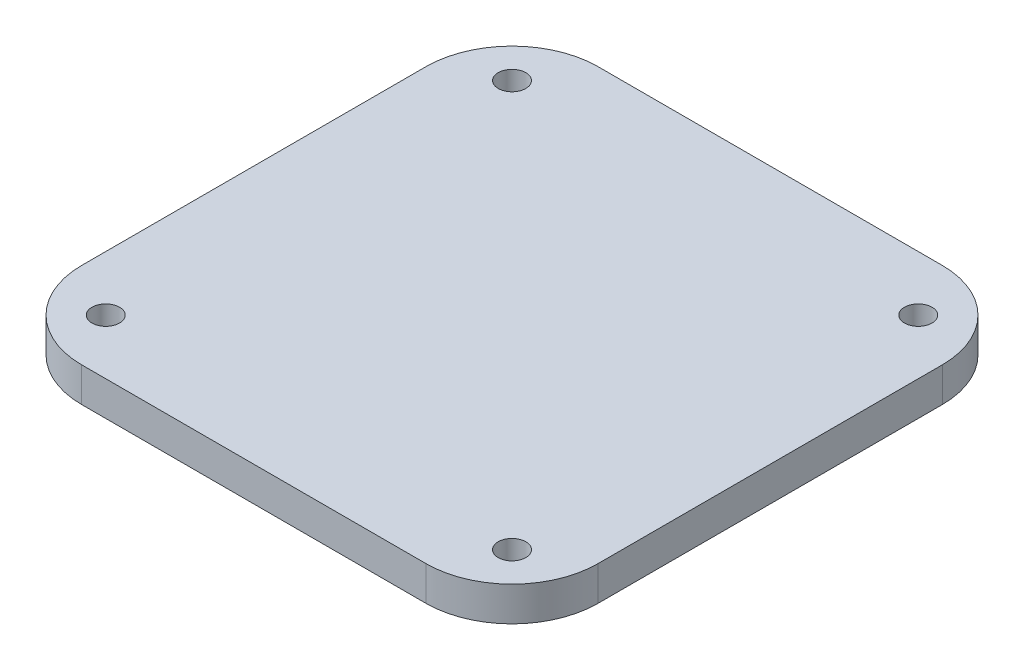
ISO-10303-21;
HEADER;
FILE_DESCRIPTION(('STEP AP214'),'2;1');
FILE_NAME('part.step','',(''),(''),'','','');
FILE_SCHEMA(('AUTOMOTIVE_DESIGN { 1 0 10303 214 1 1 1 1 }'));
ENDSEC;
DATA;
#1=APPLICATION_CONTEXT('core data for automotive mechanical design processes');
#2=APPLICATION_PROTOCOL_DEFINITION('international standard','automotive_design',2000,#1);
#3=PRODUCT_CONTEXT('',#1,'mechanical');
#4=PRODUCT('Part','Part','',(#3));
#5=PRODUCT_RELATED_PRODUCT_CATEGORY('part','',(#4));
#6=PRODUCT_DEFINITION_FORMATION('','',#4);
#7=PRODUCT_DEFINITION_CONTEXT('part definition',#1,'design');
#8=PRODUCT_DEFINITION('design','',#6,#7);
#9=PRODUCT_DEFINITION_SHAPE('','',#8);
#10=(LENGTH_UNIT() NAMED_UNIT(*) SI_UNIT(.MILLI.,.METRE.));
#11=(NAMED_UNIT(*) PLANE_ANGLE_UNIT() SI_UNIT($,.RADIAN.));
#12=(NAMED_UNIT(*) SI_UNIT($,.STERADIAN.) SOLID_ANGLE_UNIT());
#13=UNCERTAINTY_MEASURE_WITH_UNIT(LENGTH_MEASURE(1.E-05),#10,'distance_accuracy_value','');
#14=(GEOMETRIC_REPRESENTATION_CONTEXT(3) GLOBAL_UNCERTAINTY_ASSIGNED_CONTEXT((#13)) GLOBAL_UNIT_ASSIGNED_CONTEXT((#10,
#11,#12)) REPRESENTATION_CONTEXT('',''));
#15=CARTESIAN_POINT('',(0.,0.,0.));
#16=DIRECTION('',(0.,0.,1.));
#17=DIRECTION('',(1.,0.,0.));
#18=AXIS2_PLACEMENT_3D('',#15,#16,#17);
#19=CARTESIAN_POINT('',(0.,2.54,0.));
#20=DIRECTION('',(0.,1.,0.));
#21=DIRECTION('',(0.,0.,1.));
#22=AXIS2_PLACEMENT_3D('',#19,#20,#21);
#23=PLANE('',#22);
#24=CARTESIAN_POINT('',(14.986,2.54,14.986));
#25=DIRECTION('',(0.,1.,0.));
#26=DIRECTION('',(0.,0.,1.));
#27=AXIS2_PLACEMENT_3D('',#24,#25,#26);
#28=CIRCLE('',#27,1.016);
#29=CARTESIAN_POINT('',(14.986,2.54,16.002));
#30=VERTEX_POINT('',#29);
#31=EDGE_CURVE('E262',#30,#30,#28,.T.);
#32=ORIENTED_EDGE('',*,*,#31,.F.);
#33=EDGE_LOOP('',(#32));
#34=FACE_BOUND('',#33,.T.);
#35=CARTESIAN_POINT('',(-14.986,2.54,-14.986));
#36=DIRECTION('',(0.,1.,0.));
#37=DIRECTION('',(0.,0.,1.));
#38=AXIS2_PLACEMENT_3D('',#35,#36,#37);
#39=CIRCLE('',#38,1.016);
#40=CARTESIAN_POINT('',(-14.986,2.54,-13.97));
#41=VERTEX_POINT('',#40);
#42=EDGE_CURVE('E255',#41,#41,#39,.T.);
#43=ORIENTED_EDGE('',*,*,#42,.F.);
#44=EDGE_LOOP('',(#43));
#45=FACE_BOUND('',#44,.T.);
#46=DIRECTION('',(0.,0.,-1.));
#47=VECTOR('',#46,1.);
#48=CARTESIAN_POINT('',(19.05,2.54,-19.05));
#49=LINE('',#48,#47);
#50=CARTESIAN_POINT('',(19.05,2.54,12.7));
#51=VERTEX_POINT('',#50);
#52=CARTESIAN_POINT('',(19.05,2.54,-12.7));
#53=VERTEX_POINT('',#52);
#54=EDGE_CURVE('E267',#51,#53,#49,.T.);
#55=ORIENTED_EDGE('',*,*,#54,.T.);
#56=CARTESIAN_POINT('',(12.7,2.54,-12.7));
#57=DIRECTION('',(0.,1.,0.));
#58=DIRECTION('',(0.,0.,1.));
#59=AXIS2_PLACEMENT_3D('',#56,#57,#58);
#60=CIRCLE('',#59,6.35);
#61=CARTESIAN_POINT('',(12.7,2.54,-19.05));
#62=VERTEX_POINT('',#61);
#63=EDGE_CURVE('E148',#53,#62,#60,.T.);
#64=ORIENTED_EDGE('',*,*,#63,.T.);
#65=DIRECTION('',(-1.,0.,0.));
#66=VECTOR('',#65,1.);
#67=CARTESIAN_POINT('',(19.05,2.54,-19.05));
#68=LINE('',#67,#66);
#69=CARTESIAN_POINT('',(-12.7,2.54,-19.05));
#70=VERTEX_POINT('',#69);
#71=EDGE_CURVE('E120',#62,#70,#68,.T.);
#72=ORIENTED_EDGE('',*,*,#71,.T.);
#73=CARTESIAN_POINT('',(-12.7,2.54,-12.7));
#74=DIRECTION('',(0.,1.,0.));
#75=DIRECTION('',(0.,0.,1.));
#76=AXIS2_PLACEMENT_3D('',#73,#74,#75);
#77=CIRCLE('',#76,6.35);
#78=CARTESIAN_POINT('',(-19.05,2.54,-12.7));
#79=VERTEX_POINT('',#78);
#80=EDGE_CURVE('E144',#70,#79,#77,.T.);
#81=ORIENTED_EDGE('',*,*,#80,.T.);
#82=DIRECTION('',(0.,0.,1.));
#83=VECTOR('',#82,1.);
#84=CARTESIAN_POINT('',(-19.05,2.54,19.05));
#85=LINE('',#84,#83);
#86=CARTESIAN_POINT('',(-19.05,2.54,12.7));
#87=VERTEX_POINT('',#86);
#88=EDGE_CURVE('E127',#79,#87,#85,.T.);
#89=ORIENTED_EDGE('',*,*,#88,.T.);
#90=CARTESIAN_POINT('',(-12.7,2.54,12.7));
#91=DIRECTION('',(0.,1.,0.));
#92=DIRECTION('',(0.,0.,1.));
#93=AXIS2_PLACEMENT_3D('',#90,#91,#92);
#94=CIRCLE('',#93,6.35);
#95=CARTESIAN_POINT('',(-12.7,2.54,19.05));
#96=VERTEX_POINT('',#95);
#97=EDGE_CURVE('E55',#87,#96,#94,.T.);
#98=ORIENTED_EDGE('',*,*,#97,.T.);
#99=DIRECTION('',(1.,0.,0.));
#100=VECTOR('',#99,1.);
#101=CARTESIAN_POINT('',(19.05,2.54,19.05));
#102=LINE('',#101,#100);
#103=CARTESIAN_POINT('',(12.7,2.54,19.05));
#104=VERTEX_POINT('',#103);
#105=EDGE_CURVE('E130',#96,#104,#102,.T.);
#106=ORIENTED_EDGE('',*,*,#105,.T.);
#107=CARTESIAN_POINT('',(12.7,2.54,12.7));
#108=DIRECTION('',(0.,1.,0.));
#109=DIRECTION('',(0.,0.,1.));
#110=AXIS2_PLACEMENT_3D('',#107,#108,#109);
#111=CIRCLE('',#110,6.35);
#112=EDGE_CURVE('E146',#104,#51,#111,.T.);
#113=ORIENTED_EDGE('',*,*,#112,.T.);
#114=EDGE_LOOP('',(#55,#64,#72,#81,#89,#98,#106,#113));
#115=FACE_BOUND('',#114,.T.);
#116=CARTESIAN_POINT('',(-14.986,2.54,14.986));
#117=DIRECTION('',(0.,1.,0.));
#118=DIRECTION('',(0.,0.,1.));
#119=AXIS2_PLACEMENT_3D('',#116,#117,#118);
#120=CIRCLE('',#119,1.016);
#121=CARTESIAN_POINT('',(-14.986,2.54,16.002));
#122=VERTEX_POINT('',#121);
#123=EDGE_CURVE('E257',#122,#122,#120,.T.);
#124=ORIENTED_EDGE('',*,*,#123,.F.);
#125=EDGE_LOOP('',(#124));
#126=FACE_BOUND('',#125,.T.);
#127=CARTESIAN_POINT('',(14.986,2.54,-14.986));
#128=DIRECTION('',(0.,1.,0.));
#129=DIRECTION('',(0.,0.,1.));
#130=AXIS2_PLACEMENT_3D('',#127,#128,#129);
#131=CIRCLE('',#130,1.016);
#132=CARTESIAN_POINT('',(14.986,2.54,-13.97));
#133=VERTEX_POINT('',#132);
#134=EDGE_CURVE('E284',#133,#133,#131,.T.);
#135=ORIENTED_EDGE('',*,*,#134,.F.);
#136=EDGE_LOOP('',(#135));
#137=FACE_BOUND('',#136,.T.);
#138=ADVANCED_FACE('F33',(#34,#45,#115,#126,#137),#23,.T.);
#139=CARTESIAN_POINT('',(0.,0.,0.));
#140=DIRECTION('',(0.,1.,0.));
#141=DIRECTION('',(0.,0.,1.));
#142=AXIS2_PLACEMENT_3D('',#139,#140,#141);
#143=PLANE('',#142);
#144=CARTESIAN_POINT('',(-14.986,0.,14.986));
#145=DIRECTION('',(0.,1.,0.));
#146=DIRECTION('',(0.,0.,1.));
#147=AXIS2_PLACEMENT_3D('',#144,#145,#146);
#148=CIRCLE('',#147,1.516);
#149=CARTESIAN_POINT('',(-14.986,0.,16.502));
#150=VERTEX_POINT('',#149);
#151=EDGE_CURVE('E168',#150,#150,#148,.T.);
#152=ORIENTED_EDGE('',*,*,#151,.T.);
#153=EDGE_LOOP('',(#152));
#154=FACE_BOUND('',#153,.T.);
#155=CARTESIAN_POINT('',(-14.986,0.,-14.986));
#156=DIRECTION('',(0.,1.,0.));
#157=DIRECTION('',(0.,0.,1.));
#158=AXIS2_PLACEMENT_3D('',#155,#156,#157);
#159=CIRCLE('',#158,1.516);
#160=CARTESIAN_POINT('',(-14.986,0.,-13.47));
#161=VERTEX_POINT('',#160);
#162=EDGE_CURVE('E165',#161,#161,#159,.T.);
#163=ORIENTED_EDGE('',*,*,#162,.T.);
#164=EDGE_LOOP('',(#163));
#165=FACE_BOUND('',#164,.T.);
#166=CARTESIAN_POINT('',(14.986,0.,-14.986));
#167=DIRECTION('',(0.,1.,0.));
#168=DIRECTION('',(0.,0.,1.));
#169=AXIS2_PLACEMENT_3D('',#166,#167,#168);
#170=CIRCLE('',#169,1.516);
#171=CARTESIAN_POINT('',(14.986,0.,-13.47));
#172=VERTEX_POINT('',#171);
#173=EDGE_CURVE('E162',#172,#172,#170,.T.);
#174=ORIENTED_EDGE('',*,*,#173,.T.);
#175=EDGE_LOOP('',(#174));
#176=FACE_BOUND('',#175,.T.);
#177=CARTESIAN_POINT('',(14.986,0.,14.986));
#178=DIRECTION('',(0.,1.,0.));
#179=DIRECTION('',(0.,0.,1.));
#180=AXIS2_PLACEMENT_3D('',#177,#178,#179);
#181=CIRCLE('',#180,1.516);
#182=CARTESIAN_POINT('',(14.986,0.,16.502));
#183=VERTEX_POINT('',#182);
#184=EDGE_CURVE('E159',#183,#183,#181,.T.);
#185=ORIENTED_EDGE('',*,*,#184,.T.);
#186=EDGE_LOOP('',(#185));
#187=FACE_BOUND('',#186,.T.);
#188=DIRECTION('',(-1.,0.,0.));
#189=VECTOR('',#188,1.);
#190=CARTESIAN_POINT('',(19.05,0.,-19.05));
#191=LINE('',#190,#189);
#192=CARTESIAN_POINT('',(12.7,0.,-19.05));
#193=VERTEX_POINT('',#192);
#194=CARTESIAN_POINT('',(-12.7,0.,-19.05));
#195=VERTEX_POINT('',#194);
#196=EDGE_CURVE('E117',#193,#195,#191,.T.);
#197=ORIENTED_EDGE('',*,*,#196,.F.);
#198=CARTESIAN_POINT('',(12.7,0.,-12.7));
#199=DIRECTION('',(0.,1.,0.));
#200=DIRECTION('',(0.,0.,1.));
#201=AXIS2_PLACEMENT_3D('',#198,#199,#200);
#202=CIRCLE('',#201,6.35);
#203=CARTESIAN_POINT('',(19.05,0.,-12.7));
#204=VERTEX_POINT('',#203);
#205=EDGE_CURVE('E100',#193,#204,#202,.F.);
#206=ORIENTED_EDGE('',*,*,#205,.T.);
#207=DIRECTION('',(0.,0.,-1.));
#208=VECTOR('',#207,1.);
#209=CARTESIAN_POINT('',(19.05,0.,-19.05));
#210=LINE('',#209,#208);
#211=CARTESIAN_POINT('',(19.05,0.,12.7));
#212=VERTEX_POINT('',#211);
#213=EDGE_CURVE('E128',#212,#204,#210,.T.);
#214=ORIENTED_EDGE('',*,*,#213,.F.);
#215=CARTESIAN_POINT('',(12.7,0.,12.7));
#216=DIRECTION('',(0.,1.,0.));
#217=DIRECTION('',(0.,0.,1.));
#218=AXIS2_PLACEMENT_3D('',#215,#216,#217);
#219=CIRCLE('',#218,6.35);
#220=CARTESIAN_POINT('',(12.7,0.,19.05));
#221=VERTEX_POINT('',#220);
#222=EDGE_CURVE('E111',#212,#221,#219,.F.);
#223=ORIENTED_EDGE('',*,*,#222,.T.);
#224=DIRECTION('',(1.,0.,0.));
#225=VECTOR('',#224,1.);
#226=CARTESIAN_POINT('',(19.05,0.,19.05));
#227=LINE('',#226,#225);
#228=CARTESIAN_POINT('',(-12.7,0.,19.05));
#229=VERTEX_POINT('',#228);
#230=EDGE_CURVE('E132',#229,#221,#227,.T.);
#231=ORIENTED_EDGE('',*,*,#230,.F.);
#232=CARTESIAN_POINT('',(-12.7,0.,12.7));
#233=DIRECTION('',(0.,1.,0.));
#234=DIRECTION('',(0.,0.,1.));
#235=AXIS2_PLACEMENT_3D('',#232,#233,#234);
#236=CIRCLE('',#235,6.35);
#237=CARTESIAN_POINT('',(-19.05,0.,12.7));
#238=VERTEX_POINT('',#237);
#239=EDGE_CURVE('E121',#229,#238,#236,.F.);
#240=ORIENTED_EDGE('',*,*,#239,.T.);
#241=DIRECTION('',(0.,0.,1.));
#242=VECTOR('',#241,1.);
#243=CARTESIAN_POINT('',(-19.05,0.,19.05));
#244=LINE('',#243,#242);
#245=CARTESIAN_POINT('',(-19.05,0.,-12.7));
#246=VERTEX_POINT('',#245);
#247=EDGE_CURVE('E256',#246,#238,#244,.T.);
#248=ORIENTED_EDGE('',*,*,#247,.F.);
#249=CARTESIAN_POINT('',(-12.7,0.,-12.7));
#250=DIRECTION('',(0.,1.,0.));
#251=DIRECTION('',(0.,0.,1.));
#252=AXIS2_PLACEMENT_3D('',#249,#250,#251);
#253=CIRCLE('',#252,6.35);
#254=EDGE_CURVE('E126',#246,#195,#253,.F.);
#255=ORIENTED_EDGE('',*,*,#254,.T.);
#256=EDGE_LOOP('',(#197,#206,#214,#223,#231,#240,#248,#255));
#257=FACE_BOUND('',#256,.T.);
#258=ADVANCED_FACE('F124',(#154,#165,#176,#187,#257),#143,.F.);
#259=CARTESIAN_POINT('',(-19.05,2.54,19.05));
#260=DIRECTION('',(1.,0.,0.));
#261=DIRECTION('',(0.,0.,-1.));
#262=AXIS2_PLACEMENT_3D('',#259,#260,#261);
#263=PLANE('',#262);
#264=ORIENTED_EDGE('',*,*,#88,.F.);
#265=DIRECTION('',(0.,-1.,0.));
#266=VECTOR('',#265,1.);
#267=CARTESIAN_POINT('',(-19.05,2.54,-12.7));
#268=LINE('',#267,#266);
#269=EDGE_CURVE('E156',#79,#246,#268,.T.);
#270=ORIENTED_EDGE('',*,*,#269,.T.);
#271=ORIENTED_EDGE('',*,*,#247,.T.);
#272=DIRECTION('',(0.,-1.,0.));
#273=VECTOR('',#272,1.);
#274=CARTESIAN_POINT('',(-19.05,2.54,12.7));
#275=LINE('',#274,#273);
#276=EDGE_CURVE('E154',#238,#87,#275,.F.);
#277=ORIENTED_EDGE('',*,*,#276,.T.);
#278=EDGE_LOOP('',(#264,#270,#271,#277));
#279=FACE_BOUND('',#278,.T.);
#280=ADVANCED_FACE('F190',(#279),#263,.F.);
#281=CARTESIAN_POINT('',(19.05,2.54,19.05));
#282=DIRECTION('',(0.,0.,-1.));
#283=DIRECTION('',(-1.,0.,0.));
#284=AXIS2_PLACEMENT_3D('',#281,#282,#283);
#285=PLANE('',#284);
#286=ORIENTED_EDGE('',*,*,#230,.T.);
#287=DIRECTION('',(0.,-1.,0.));
#288=VECTOR('',#287,1.);
#289=CARTESIAN_POINT('',(12.7,2.54,19.05));
#290=LINE('',#289,#288);
#291=EDGE_CURVE('E48',#221,#104,#290,.F.);
#292=ORIENTED_EDGE('',*,*,#291,.T.);
#293=ORIENTED_EDGE('',*,*,#105,.F.);
#294=DIRECTION('',(0.,-1.,0.));
#295=VECTOR('',#294,1.);
#296=CARTESIAN_POINT('',(-12.7,2.54,19.05));
#297=LINE('',#296,#295);
#298=EDGE_CURVE('E150',#96,#229,#297,.T.);
#299=ORIENTED_EDGE('',*,*,#298,.T.);
#300=EDGE_LOOP('',(#286,#292,#293,#299));
#301=FACE_BOUND('',#300,.T.);
#302=ADVANCED_FACE('F216',(#301),#285,.F.);
#303=CARTESIAN_POINT('',(19.05,2.54,-19.05));
#304=DIRECTION('',(-1.,0.,0.));
#305=DIRECTION('',(0.,0.,1.));
#306=AXIS2_PLACEMENT_3D('',#303,#304,#305);
#307=PLANE('',#306);
#308=ORIENTED_EDGE('',*,*,#213,.T.);
#309=DIRECTION('',(0.,-1.,0.));
#310=VECTOR('',#309,1.);
#311=CARTESIAN_POINT('',(19.05,2.54,-12.7));
#312=LINE('',#311,#310);
#313=EDGE_CURVE('E105',#204,#53,#312,.F.);
#314=ORIENTED_EDGE('',*,*,#313,.T.);
#315=ORIENTED_EDGE('',*,*,#54,.F.);
#316=DIRECTION('',(0.,-1.,0.));
#317=VECTOR('',#316,1.);
#318=CARTESIAN_POINT('',(19.05,2.54,12.7));
#319=LINE('',#318,#317);
#320=EDGE_CURVE('E110',#51,#212,#319,.T.);
#321=ORIENTED_EDGE('',*,*,#320,.T.);
#322=EDGE_LOOP('',(#308,#314,#315,#321));
#323=FACE_BOUND('',#322,.T.);
#324=ADVANCED_FACE('F213',(#323),#307,.F.);
#325=CARTESIAN_POINT('',(19.05,2.54,-19.05));
#326=DIRECTION('',(0.,0.,1.));
#327=DIRECTION('',(1.,0.,0.));
#328=AXIS2_PLACEMENT_3D('',#325,#326,#327);
#329=PLANE('',#328);
#330=ORIENTED_EDGE('',*,*,#71,.F.);
#331=DIRECTION('',(0.,-1.,0.));
#332=VECTOR('',#331,1.);
#333=CARTESIAN_POINT('',(12.7,2.54,-19.05));
#334=LINE('',#333,#332);
#335=EDGE_CURVE('E104',#62,#193,#334,.T.);
#336=ORIENTED_EDGE('',*,*,#335,.T.);
#337=ORIENTED_EDGE('',*,*,#196,.T.);
#338=DIRECTION('',(0.,-1.,0.));
#339=VECTOR('',#338,1.);
#340=CARTESIAN_POINT('',(-12.7,2.54,-19.05));
#341=LINE('',#340,#339);
#342=EDGE_CURVE('E122',#195,#70,#341,.F.);
#343=ORIENTED_EDGE('',*,*,#342,.T.);
#344=EDGE_LOOP('',(#330,#336,#337,#343));
#345=FACE_BOUND('',#344,.T.);
#346=ADVANCED_FACE('F116',(#345),#329,.F.);
#347=CARTESIAN_POINT('',(-14.986,2.54,-14.986));
#348=DIRECTION('',(0.,-1.,0.));
#349=DIRECTION('',(0.,0.,-1.));
#350=AXIS2_PLACEMENT_3D('',#347,#348,#349);
#351=CYLINDRICAL_SURFACE('',#350,1.016);
#352=CARTESIAN_POINT('',(-14.986,0.5,-14.986));
#353=DIRECTION('',(0.,1.,0.));
#354=DIRECTION('',(0.,0.,1.));
#355=AXIS2_PLACEMENT_3D('',#352,#353,#354);
#356=CIRCLE('',#355,1.016);
#357=CARTESIAN_POINT('',(-14.986,0.5,-13.97));
#358=VERTEX_POINT('',#357);
#359=EDGE_CURVE('E174',#358,#358,#356,.F.);
#360=ORIENTED_EDGE('',*,*,#359,.T.);
#361=EDGE_LOOP('',(#360));
#362=FACE_BOUND('',#361,.T.);
#363=ORIENTED_EDGE('',*,*,#42,.T.);
#364=EDGE_LOOP('',(#363));
#365=FACE_BOUND('',#364,.T.);
#366=ADVANCED_FACE('F208',(#362,#365),#351,.F.);
#367=CARTESIAN_POINT('',(-14.986,2.54,14.986));
#368=DIRECTION('',(0.,-1.,0.));
#369=DIRECTION('',(0.,0.,-1.));
#370=AXIS2_PLACEMENT_3D('',#367,#368,#369);
#371=CYLINDRICAL_SURFACE('',#370,1.016);
#372=CARTESIAN_POINT('',(-14.986,0.5,14.986));
#373=DIRECTION('',(0.,1.,0.));
#374=DIRECTION('',(0.,0.,1.));
#375=AXIS2_PLACEMENT_3D('',#372,#373,#374);
#376=CIRCLE('',#375,1.016);
#377=CARTESIAN_POINT('',(-14.986,0.5,16.002));
#378=VERTEX_POINT('',#377);
#379=EDGE_CURVE('E171',#378,#378,#376,.F.);
#380=ORIENTED_EDGE('',*,*,#379,.T.);
#381=EDGE_LOOP('',(#380));
#382=FACE_BOUND('',#381,.T.);
#383=ORIENTED_EDGE('',*,*,#123,.T.);
#384=EDGE_LOOP('',(#383));
#385=FACE_BOUND('',#384,.T.);
#386=ADVANCED_FACE('F252',(#382,#385),#371,.F.);
#387=CARTESIAN_POINT('',(14.986,2.54,14.986));
#388=DIRECTION('',(0.,-1.,0.));
#389=DIRECTION('',(0.,0.,-1.));
#390=AXIS2_PLACEMENT_3D('',#387,#388,#389);
#391=CYLINDRICAL_SURFACE('',#390,1.016);
#392=CARTESIAN_POINT('',(14.986,0.5,14.986));
#393=DIRECTION('',(0.,1.,0.));
#394=DIRECTION('',(0.,0.,1.));
#395=AXIS2_PLACEMENT_3D('',#392,#393,#394);
#396=CIRCLE('',#395,1.016);
#397=CARTESIAN_POINT('',(14.986,0.5,16.002));
#398=VERTEX_POINT('',#397);
#399=EDGE_CURVE('E11',#398,#398,#396,.F.);
#400=ORIENTED_EDGE('',*,*,#399,.T.);
#401=EDGE_LOOP('',(#400));
#402=FACE_BOUND('',#401,.T.);
#403=ORIENTED_EDGE('',*,*,#31,.T.);
#404=EDGE_LOOP('',(#403));
#405=FACE_BOUND('',#404,.T.);
#406=ADVANCED_FACE('F288',(#402,#405),#391,.F.);
#407=CARTESIAN_POINT('',(14.986,2.54,-14.986));
#408=DIRECTION('',(0.,-1.,0.));
#409=DIRECTION('',(0.,0.,-1.));
#410=AXIS2_PLACEMENT_3D('',#407,#408,#409);
#411=CYLINDRICAL_SURFACE('',#410,1.016);
#412=CARTESIAN_POINT('',(14.986,0.5,-14.986));
#413=DIRECTION('',(0.,1.,0.));
#414=DIRECTION('',(0.,0.,1.));
#415=AXIS2_PLACEMENT_3D('',#412,#413,#414);
#416=CIRCLE('',#415,1.016);
#417=CARTESIAN_POINT('',(14.986,0.5,-13.97));
#418=VERTEX_POINT('',#417);
#419=EDGE_CURVE('E41',#418,#418,#416,.F.);
#420=ORIENTED_EDGE('',*,*,#419,.T.);
#421=EDGE_LOOP('',(#420));
#422=FACE_BOUND('',#421,.T.);
#423=ORIENTED_EDGE('',*,*,#134,.T.);
#424=EDGE_LOOP('',(#423));
#425=FACE_BOUND('',#424,.T.);
#426=ADVANCED_FACE('F179',(#422,#425),#411,.F.);
#427=CARTESIAN_POINT('',(12.7,2.54,-12.7));
#428=DIRECTION('',(0.,-1.,0.));
#429=DIRECTION('',(0.,0.,-1.));
#430=AXIS2_PLACEMENT_3D('',#427,#428,#429);
#431=CYLINDRICAL_SURFACE('',#430,6.35);
#432=ORIENTED_EDGE('',*,*,#63,.F.);
#433=ORIENTED_EDGE('',*,*,#313,.F.);
#434=ORIENTED_EDGE('',*,*,#205,.F.);
#435=ORIENTED_EDGE('',*,*,#335,.F.);
#436=EDGE_LOOP('',(#432,#433,#434,#435));
#437=FACE_BOUND('',#436,.T.);
#438=ADVANCED_FACE('F103',(#437),#431,.T.);
#439=CARTESIAN_POINT('',(12.7,2.54,12.7));
#440=DIRECTION('',(0.,-1.,0.));
#441=DIRECTION('',(0.,0.,-1.));
#442=AXIS2_PLACEMENT_3D('',#439,#440,#441);
#443=CYLINDRICAL_SURFACE('',#442,6.35);
#444=ORIENTED_EDGE('',*,*,#112,.F.);
#445=ORIENTED_EDGE('',*,*,#291,.F.);
#446=ORIENTED_EDGE('',*,*,#222,.F.);
#447=ORIENTED_EDGE('',*,*,#320,.F.);
#448=EDGE_LOOP('',(#444,#445,#446,#447));
#449=FACE_BOUND('',#448,.T.);
#450=ADVANCED_FACE('F225',(#449),#443,.T.);
#451=CARTESIAN_POINT('',(-12.7,2.54,-12.7));
#452=DIRECTION('',(0.,-1.,0.));
#453=DIRECTION('',(0.,0.,-1.));
#454=AXIS2_PLACEMENT_3D('',#451,#452,#453);
#455=CYLINDRICAL_SURFACE('',#454,6.35);
#456=ORIENTED_EDGE('',*,*,#80,.F.);
#457=ORIENTED_EDGE('',*,*,#342,.F.);
#458=ORIENTED_EDGE('',*,*,#254,.F.);
#459=ORIENTED_EDGE('',*,*,#269,.F.);
#460=EDGE_LOOP('',(#456,#457,#458,#459));
#461=FACE_BOUND('',#460,.T.);
#462=ADVANCED_FACE('F228',(#461),#455,.T.);
#463=CARTESIAN_POINT('',(-12.7,2.54,12.7));
#464=DIRECTION('',(0.,-1.,0.));
#465=DIRECTION('',(0.,0.,-1.));
#466=AXIS2_PLACEMENT_3D('',#463,#464,#465);
#467=CYLINDRICAL_SURFACE('',#466,6.35);
#468=ORIENTED_EDGE('',*,*,#97,.F.);
#469=ORIENTED_EDGE('',*,*,#276,.F.);
#470=ORIENTED_EDGE('',*,*,#239,.F.);
#471=ORIENTED_EDGE('',*,*,#298,.F.);
#472=EDGE_LOOP('',(#468,#469,#470,#471));
#473=FACE_BOUND('',#472,.T.);
#474=ADVANCED_FACE('F232',(#473),#467,.T.);
#475=CARTESIAN_POINT('',(-14.986,0.5,14.986));
#476=DIRECTION('',(0.,1.,0.));
#477=DIRECTION('',(0.,0.,1.));
#478=AXIS2_PLACEMENT_3D('',#475,#476,#477);
#479=TOROIDAL_SURFACE('',#478,1.516,0.5);
#480=ORIENTED_EDGE('',*,*,#379,.F.);
#481=EDGE_LOOP('',(#480));
#482=FACE_BOUND('',#481,.T.);
#483=ORIENTED_EDGE('',*,*,#151,.F.);
#484=EDGE_LOOP('',(#483));
#485=FACE_BOUND('',#484,.T.);
#486=ADVANCED_FACE('F236',(#482,#485),#479,.T.);
#487=CARTESIAN_POINT('',(-14.986,0.5,-14.986));
#488=DIRECTION('',(0.,1.,0.));
#489=DIRECTION('',(0.,0.,1.));
#490=AXIS2_PLACEMENT_3D('',#487,#488,#489);
#491=TOROIDAL_SURFACE('',#490,1.516,0.5);
#492=ORIENTED_EDGE('',*,*,#359,.F.);
#493=EDGE_LOOP('',(#492));
#494=FACE_BOUND('',#493,.T.);
#495=ORIENTED_EDGE('',*,*,#162,.F.);
#496=EDGE_LOOP('',(#495));
#497=FACE_BOUND('',#496,.T.);
#498=ADVANCED_FACE('F185',(#494,#497),#491,.T.);
#499=CARTESIAN_POINT('',(14.986,0.5,-14.986));
#500=DIRECTION('',(0.,1.,0.));
#501=DIRECTION('',(0.,0.,1.));
#502=AXIS2_PLACEMENT_3D('',#499,#500,#501);
#503=TOROIDAL_SURFACE('',#502,1.516,0.5);
#504=ORIENTED_EDGE('',*,*,#419,.F.);
#505=EDGE_LOOP('',(#504));
#506=FACE_BOUND('',#505,.T.);
#507=ORIENTED_EDGE('',*,*,#173,.F.);
#508=EDGE_LOOP('',(#507));
#509=FACE_BOUND('',#508,.T.);
#510=ADVANCED_FACE('F182',(#506,#509),#503,.T.);
#511=CARTESIAN_POINT('',(14.986,0.5,14.986));
#512=DIRECTION('',(0.,1.,0.));
#513=DIRECTION('',(0.,0.,1.));
#514=AXIS2_PLACEMENT_3D('',#511,#512,#513);
#515=TOROIDAL_SURFACE('',#514,1.516,0.5);
#516=ORIENTED_EDGE('',*,*,#399,.F.);
#517=EDGE_LOOP('',(#516));
#518=FACE_BOUND('',#517,.T.);
#519=ORIENTED_EDGE('',*,*,#184,.F.);
#520=EDGE_LOOP('',(#519));
#521=FACE_BOUND('',#520,.T.);
#522=ADVANCED_FACE('F35',(#518,#521),#515,.T.);
#523=CLOSED_SHELL('',(#138,#258,#280,#302,#324,#346,#366,#386,#406,#426,#438,#450,#462,#474,
#486,#498,#510,#522));
#524=MANIFOLD_SOLID_BREP('B2',#523);
#525=ADVANCED_BREP_SHAPE_REPRESENTATION('',(#18,#524),#14);
#526=SHAPE_DEFINITION_REPRESENTATION(#9,#525);
ENDSEC;
END-ISO-10303-21;
